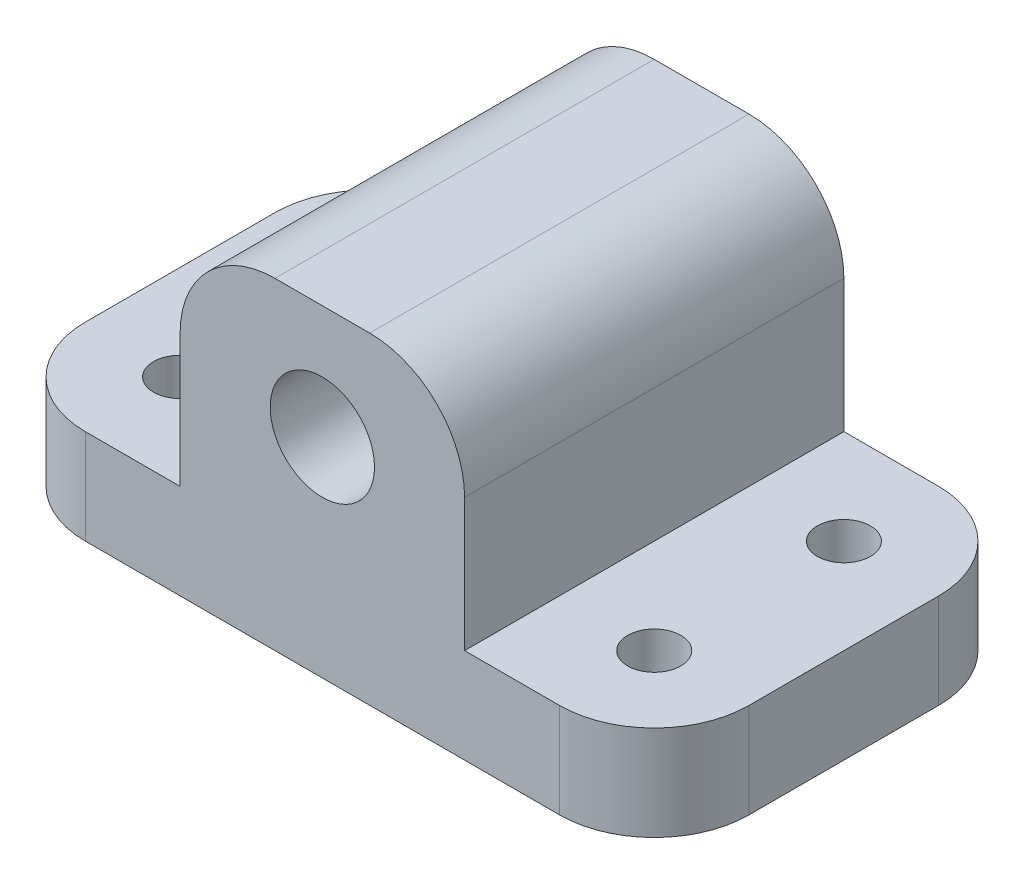
ISO-10303-21;
HEADER;
FILE_DESCRIPTION(('STEP AP214'),'2;1');
FILE_NAME('part.step','',(''),(''),'','','');
FILE_SCHEMA(('AUTOMOTIVE_DESIGN { 1 0 10303 214 1 1 1 1 }'));
ENDSEC;
DATA;
#1=APPLICATION_CONTEXT('core data for automotive mechanical design processes');
#2=APPLICATION_PROTOCOL_DEFINITION('international standard','automotive_design',2000,#1);
#3=PRODUCT_CONTEXT('',#1,'mechanical');
#4=PRODUCT('Part','Part','',(#3));
#5=PRODUCT_RELATED_PRODUCT_CATEGORY('part','',(#4));
#6=PRODUCT_DEFINITION_FORMATION('','',#4);
#7=PRODUCT_DEFINITION_CONTEXT('part definition',#1,'design');
#8=PRODUCT_DEFINITION('design','',#6,#7);
#9=PRODUCT_DEFINITION_SHAPE('','',#8);
#10=(LENGTH_UNIT() NAMED_UNIT(*) SI_UNIT(.MILLI.,.METRE.));
#11=(NAMED_UNIT(*) PLANE_ANGLE_UNIT() SI_UNIT($,.RADIAN.));
#12=(NAMED_UNIT(*) SI_UNIT($,.STERADIAN.) SOLID_ANGLE_UNIT());
#13=UNCERTAINTY_MEASURE_WITH_UNIT(LENGTH_MEASURE(1.E-05),#10,'distance_accuracy_value','');
#14=(GEOMETRIC_REPRESENTATION_CONTEXT(3) GLOBAL_UNCERTAINTY_ASSIGNED_CONTEXT((#13)) GLOBAL_UNIT_ASSIGNED_CONTEXT((#10,
#11,#12)) REPRESENTATION_CONTEXT('',''));
#15=CARTESIAN_POINT('',(0.,0.,0.));
#16=DIRECTION('',(0.,0.,1.));
#17=DIRECTION('',(1.,0.,0.));
#18=AXIS2_PLACEMENT_3D('',#15,#16,#17);
#19=CARTESIAN_POINT('',(0.,0.,25.4));
#20=DIRECTION('',(0.,0.,1.));
#21=DIRECTION('',(1.,0.,0.));
#22=AXIS2_PLACEMENT_3D('',#19,#20,#21);
#23=PLANE('',#22);
#24=DIRECTION('',(1.,0.,0.));
#25=VECTOR('',#24,1.);
#26=CARTESIAN_POINT('',(0.,0.,25.4));
#27=LINE('',#26,#25);
#28=CARTESIAN_POINT('',(6.35,0.,25.4));
#29=VERTEX_POINT('',#28);
#30=CARTESIAN_POINT('',(38.1,0.,25.4));
#31=VERTEX_POINT('',#30);
#32=EDGE_CURVE('E146',#29,#31,#27,.T.);
#33=ORIENTED_EDGE('',*,*,#32,.T.);
#34=DIRECTION('',(0.,1.,0.));
#35=VECTOR('',#34,1.);
#36=CARTESIAN_POINT('',(38.1,6.35,25.4));
#37=LINE('',#36,#35);
#38=CARTESIAN_POINT('',(38.1,6.35,25.4));
#39=VERTEX_POINT('',#38);
#40=EDGE_CURVE('E11',#31,#39,#37,.T.);
#41=ORIENTED_EDGE('',*,*,#40,.T.);
#42=DIRECTION('',(-1.,0.,0.));
#43=VECTOR('',#42,1.);
#44=CARTESIAN_POINT('',(44.45,6.35,25.4));
#45=LINE('',#44,#43);
#46=CARTESIAN_POINT('',(31.75,6.35,25.4));
#47=VERTEX_POINT('',#46);
#48=EDGE_CURVE('E138',#39,#47,#45,.T.);
#49=ORIENTED_EDGE('',*,*,#48,.T.);
#50=DIRECTION('',(0.,1.,0.));
#51=VECTOR('',#50,1.);
#52=CARTESIAN_POINT('',(31.75,6.35,25.4));
#53=LINE('',#52,#51);
#54=CARTESIAN_POINT('',(31.75,15.24,25.4));
#55=VERTEX_POINT('',#54);
#56=EDGE_CURVE('E143',#47,#55,#53,.T.);
#57=ORIENTED_EDGE('',*,*,#56,.T.);
#58=CARTESIAN_POINT('',(25.4,15.24,25.4));
#59=DIRECTION('',(0.,0.,1.));
#60=DIRECTION('',(1.,0.,0.));
#61=AXIS2_PLACEMENT_3D('',#58,#59,#60);
#62=CIRCLE('',#61,6.35);
#63=CARTESIAN_POINT('',(25.4,21.59,25.4));
#64=VERTEX_POINT('',#63);
#65=EDGE_CURVE('E213',#55,#64,#62,.T.);
#66=ORIENTED_EDGE('',*,*,#65,.T.);
#67=DIRECTION('',(-1.,0.,0.));
#68=VECTOR('',#67,1.);
#69=CARTESIAN_POINT('',(31.75,21.59,25.4));
#70=LINE('',#69,#68);
#71=CARTESIAN_POINT('',(19.05,21.59,25.4));
#72=VERTEX_POINT('',#71);
#73=EDGE_CURVE('E163',#64,#72,#70,.T.);
#74=ORIENTED_EDGE('',*,*,#73,.T.);
#75=CARTESIAN_POINT('',(19.05,15.24,25.4));
#76=DIRECTION('',(0.,0.,1.));
#77=DIRECTION('',(1.,0.,0.));
#78=AXIS2_PLACEMENT_3D('',#75,#76,#77);
#79=CIRCLE('',#78,6.35);
#80=CARTESIAN_POINT('',(12.7,15.24,25.4));
#81=VERTEX_POINT('',#80);
#82=EDGE_CURVE('E211',#72,#81,#79,.T.);
#83=ORIENTED_EDGE('',*,*,#82,.T.);
#84=DIRECTION('',(0.,-1.,0.));
#85=VECTOR('',#84,1.);
#86=CARTESIAN_POINT('',(12.7,21.59,25.4));
#87=LINE('',#86,#85);
#88=CARTESIAN_POINT('',(12.7,6.35,25.4));
#89=VERTEX_POINT('',#88);
#90=EDGE_CURVE('E166',#81,#89,#87,.T.);
#91=ORIENTED_EDGE('',*,*,#90,.T.);
#92=DIRECTION('',(-1.,0.,0.));
#93=VECTOR('',#92,1.);
#94=CARTESIAN_POINT('',(12.7,6.35,25.4));
#95=LINE('',#94,#93);
#96=CARTESIAN_POINT('',(6.35,6.35,25.4));
#97=VERTEX_POINT('',#96);
#98=EDGE_CURVE('E171',#89,#97,#95,.T.);
#99=ORIENTED_EDGE('',*,*,#98,.T.);
#100=DIRECTION('',(0.,-1.,0.));
#101=VECTOR('',#100,1.);
#102=CARTESIAN_POINT('',(6.35,0.,25.4));
#103=LINE('',#102,#101);
#104=EDGE_CURVE('E44',#97,#29,#103,.T.);
#105=ORIENTED_EDGE('',*,*,#104,.T.);
#106=EDGE_LOOP('',(#33,#41,#49,#57,#66,#74,#83,#91,#99,#105));
#107=FACE_BOUND('',#106,.T.);
#108=CARTESIAN_POINT('',(22.225,13.97,25.4));
#109=DIRECTION('',(0.,0.,1.));
#110=DIRECTION('',(1.,0.,0.));
#111=AXIS2_PLACEMENT_3D('',#108,#109,#110);
#112=CIRCLE('',#111,3.4925);
#113=CARTESIAN_POINT('',(25.7175,13.97,25.4));
#114=VERTEX_POINT('',#113);
#115=EDGE_CURVE('E178',#114,#114,#112,.T.);
#116=ORIENTED_EDGE('',*,*,#115,.F.);
#117=EDGE_LOOP('',(#116));
#118=FACE_BOUND('',#117,.T.);
#119=ADVANCED_FACE('F36',(#107,#118),#23,.T.);
#120=CARTESIAN_POINT('',(0.,0.,0.));
#121=DIRECTION('',(0.,0.,1.));
#122=DIRECTION('',(1.,0.,0.));
#123=AXIS2_PLACEMENT_3D('',#120,#121,#122);
#124=PLANE('',#123);
#125=DIRECTION('',(1.,0.,0.));
#126=VECTOR('',#125,1.);
#127=CARTESIAN_POINT('',(0.,0.,0.));
#128=LINE('',#127,#126);
#129=CARTESIAN_POINT('',(6.35,0.,0.));
#130=VERTEX_POINT('',#129);
#131=CARTESIAN_POINT('',(38.1,0.,0.));
#132=VERTEX_POINT('',#131);
#133=EDGE_CURVE('E175',#130,#132,#128,.T.);
#134=ORIENTED_EDGE('',*,*,#133,.F.);
#135=DIRECTION('',(0.,-1.,0.));
#136=VECTOR('',#135,1.);
#137=CARTESIAN_POINT('',(6.35,0.,0.));
#138=LINE('',#137,#136);
#139=CARTESIAN_POINT('',(6.35,6.35,0.));
#140=VERTEX_POINT('',#139);
#141=EDGE_CURVE('E233',#130,#140,#138,.F.);
#142=ORIENTED_EDGE('',*,*,#141,.T.);
#143=DIRECTION('',(-1.,0.,0.));
#144=VECTOR('',#143,1.);
#145=CARTESIAN_POINT('',(12.7,6.35,0.));
#146=LINE('',#145,#144);
#147=CARTESIAN_POINT('',(12.7,6.35,0.));
#148=VERTEX_POINT('',#147);
#149=EDGE_CURVE('E187',#148,#140,#146,.T.);
#150=ORIENTED_EDGE('',*,*,#149,.F.);
#151=DIRECTION('',(0.,-1.,0.));
#152=VECTOR('',#151,1.);
#153=CARTESIAN_POINT('',(12.7,21.59,0.));
#154=LINE('',#153,#152);
#155=CARTESIAN_POINT('',(12.7,15.24,0.));
#156=VERTEX_POINT('',#155);
#157=EDGE_CURVE('E185',#156,#148,#154,.T.);
#158=ORIENTED_EDGE('',*,*,#157,.F.);
#159=CARTESIAN_POINT('',(19.05,15.24,0.));
#160=DIRECTION('',(0.,0.,1.));
#161=DIRECTION('',(1.,0.,0.));
#162=AXIS2_PLACEMENT_3D('',#159,#160,#161);
#163=CIRCLE('',#162,6.35);
#164=CARTESIAN_POINT('',(19.05,21.59,0.));
#165=VERTEX_POINT('',#164);
#166=EDGE_CURVE('E206',#156,#165,#163,.F.);
#167=ORIENTED_EDGE('',*,*,#166,.T.);
#168=DIRECTION('',(-1.,0.,0.));
#169=VECTOR('',#168,1.);
#170=CARTESIAN_POINT('',(31.75,21.59,0.));
#171=LINE('',#170,#169);
#172=CARTESIAN_POINT('',(25.4,21.59,0.));
#173=VERTEX_POINT('',#172);
#174=EDGE_CURVE('E182',#173,#165,#171,.T.);
#175=ORIENTED_EDGE('',*,*,#174,.F.);
#176=CARTESIAN_POINT('',(25.4,15.24,0.));
#177=DIRECTION('',(0.,0.,1.));
#178=DIRECTION('',(1.,0.,0.));
#179=AXIS2_PLACEMENT_3D('',#176,#177,#178);
#180=CIRCLE('',#179,6.35);
#181=CARTESIAN_POINT('',(31.75,15.24,0.));
#182=VERTEX_POINT('',#181);
#183=EDGE_CURVE('E208',#173,#182,#180,.F.);
#184=ORIENTED_EDGE('',*,*,#183,.T.);
#185=DIRECTION('',(0.,1.,0.));
#186=VECTOR('',#185,1.);
#187=CARTESIAN_POINT('',(31.75,6.35,0.));
#188=LINE('',#187,#186);
#189=CARTESIAN_POINT('',(31.75,6.35,0.));
#190=VERTEX_POINT('',#189);
#191=EDGE_CURVE('E180',#190,#182,#188,.T.);
#192=ORIENTED_EDGE('',*,*,#191,.F.);
#193=DIRECTION('',(-1.,0.,0.));
#194=VECTOR('',#193,1.);
#195=CARTESIAN_POINT('',(44.45,6.35,0.));
#196=LINE('',#195,#194);
#197=CARTESIAN_POINT('',(38.1,6.35,0.));
#198=VERTEX_POINT('',#197);
#199=EDGE_CURVE('E153',#198,#190,#196,.T.);
#200=ORIENTED_EDGE('',*,*,#199,.F.);
#201=DIRECTION('',(0.,1.,0.));
#202=VECTOR('',#201,1.);
#203=CARTESIAN_POINT('',(38.1,0.,0.));
#204=LINE('',#203,#202);
#205=EDGE_CURVE('E231',#198,#132,#204,.F.);
#206=ORIENTED_EDGE('',*,*,#205,.T.);
#207=EDGE_LOOP('',(#134,#142,#150,#158,#167,#175,#184,#192,#200,#206));
#208=FACE_BOUND('',#207,.T.);
#209=CARTESIAN_POINT('',(22.225,13.97,0.));
#210=DIRECTION('',(0.,0.,1.));
#211=DIRECTION('',(1.,0.,0.));
#212=AXIS2_PLACEMENT_3D('',#209,#210,#211);
#213=CIRCLE('',#212,3.4925);
#214=CARTESIAN_POINT('',(25.7175,13.97,0.));
#215=VERTEX_POINT('',#214);
#216=EDGE_CURVE('E256',#215,#215,#213,.T.);
#217=ORIENTED_EDGE('',*,*,#216,.T.);
#218=EDGE_LOOP('',(#217));
#219=FACE_BOUND('',#218,.T.);
#220=ADVANCED_FACE('F310',(#208,#219),#124,.F.);
#221=CARTESIAN_POINT('',(0.,6.35,25.4));
#222=DIRECTION('',(1.,0.,0.));
#223=DIRECTION('',(0.,0.,-1.));
#224=AXIS2_PLACEMENT_3D('',#221,#222,#223);
#225=PLANE('',#224);
#226=DIRECTION('',(0.,0.,-1.));
#227=VECTOR('',#226,1.);
#228=CARTESIAN_POINT('',(0.,6.35,25.4));
#229=LINE('',#228,#227);
#230=CARTESIAN_POINT('',(0.,6.35,19.05));
#231=VERTEX_POINT('',#230);
#232=CARTESIAN_POINT('',(0.,6.35,6.35));
#233=VERTEX_POINT('',#232);
#234=EDGE_CURVE('E174',#231,#233,#229,.T.);
#235=ORIENTED_EDGE('',*,*,#234,.T.);
#236=DIRECTION('',(0.,-1.,0.));
#237=VECTOR('',#236,1.);
#238=CARTESIAN_POINT('',(0.,6.35,6.35));
#239=LINE('',#238,#237);
#240=CARTESIAN_POINT('',(0.,0.,6.35));
#241=VERTEX_POINT('',#240);
#242=EDGE_CURVE('E220',#233,#241,#239,.T.);
#243=ORIENTED_EDGE('',*,*,#242,.T.);
#244=DIRECTION('',(0.,0.,-1.));
#245=VECTOR('',#244,1.);
#246=CARTESIAN_POINT('',(0.,0.,25.4));
#247=LINE('',#246,#245);
#248=CARTESIAN_POINT('',(0.,0.,19.05));
#249=VERTEX_POINT('',#248);
#250=EDGE_CURVE('E198',#249,#241,#247,.T.);
#251=ORIENTED_EDGE('',*,*,#250,.F.);
#252=DIRECTION('',(0.,-1.,0.));
#253=VECTOR('',#252,1.);
#254=CARTESIAN_POINT('',(0.,6.35,19.05));
#255=LINE('',#254,#253);
#256=EDGE_CURVE('E218',#249,#231,#255,.F.);
#257=ORIENTED_EDGE('',*,*,#256,.T.);
#258=EDGE_LOOP('',(#235,#243,#251,#257));
#259=FACE_BOUND('',#258,.T.);
#260=ADVANCED_FACE('F315',(#259),#225,.F.);
#261=CARTESIAN_POINT('',(0.,0.,25.4));
#262=DIRECTION('',(0.,1.,0.));
#263=DIRECTION('',(0.,0.,1.));
#264=AXIS2_PLACEMENT_3D('',#261,#262,#263);
#265=PLANE('',#264);
#266=CARTESIAN_POINT('',(6.35,0.,19.05));
#267=DIRECTION('',(0.,1.,0.));
#268=DIRECTION('',(0.,0.,1.));
#269=AXIS2_PLACEMENT_3D('',#266,#267,#268);
#270=CIRCLE('',#269,1.778);
#271=CARTESIAN_POINT('',(6.35,0.,20.828));
#272=VERTEX_POINT('',#271);
#273=EDGE_CURVE('E265',#272,#272,#270,.T.);
#274=ORIENTED_EDGE('',*,*,#273,.T.);
#275=EDGE_LOOP('',(#274));
#276=FACE_BOUND('',#275,.T.);
#277=CARTESIAN_POINT('',(38.1,0.,6.34999999999999));
#278=DIRECTION('',(0.,1.,0.));
#279=DIRECTION('',(0.,0.,1.));
#280=AXIS2_PLACEMENT_3D('',#277,#278,#279);
#281=CIRCLE('',#280,1.778);
#282=CARTESIAN_POINT('',(38.1,0.,8.12799999999999));
#283=VERTEX_POINT('',#282);
#284=EDGE_CURVE('E271',#283,#283,#281,.T.);
#285=ORIENTED_EDGE('',*,*,#284,.T.);
#286=EDGE_LOOP('',(#285));
#287=FACE_BOUND('',#286,.T.);
#288=CARTESIAN_POINT('',(38.1,0.,19.05));
#289=DIRECTION('',(0.,1.,0.));
#290=DIRECTION('',(0.,0.,1.));
#291=AXIS2_PLACEMENT_3D('',#288,#289,#290);
#292=CIRCLE('',#291,1.778);
#293=CARTESIAN_POINT('',(38.1,0.,20.828));
#294=VERTEX_POINT('',#293);
#295=EDGE_CURVE('E272',#294,#294,#292,.T.);
#296=ORIENTED_EDGE('',*,*,#295,.T.);
#297=EDGE_LOOP('',(#296));
#298=FACE_BOUND('',#297,.T.);
#299=CARTESIAN_POINT('',(6.35,0.,6.34999999999999));
#300=DIRECTION('',(0.,1.,0.));
#301=DIRECTION('',(0.,0.,1.));
#302=AXIS2_PLACEMENT_3D('',#299,#300,#301);
#303=CIRCLE('',#302,1.778);
#304=CARTESIAN_POINT('',(6.35,0.,8.12799999999999));
#305=VERTEX_POINT('',#304);
#306=EDGE_CURVE('E259',#305,#305,#303,.T.);
#307=ORIENTED_EDGE('',*,*,#306,.T.);
#308=EDGE_LOOP('',(#307));
#309=FACE_BOUND('',#308,.T.);
#310=ORIENTED_EDGE('',*,*,#250,.T.);
#311=CARTESIAN_POINT('',(6.35,0.,6.35));
#312=DIRECTION('',(0.,1.,0.));
#313=DIRECTION('',(0.,0.,1.));
#314=AXIS2_PLACEMENT_3D('',#311,#312,#313);
#315=CIRCLE('',#314,6.35);
#316=EDGE_CURVE('E229',#241,#130,#315,.F.);
#317=ORIENTED_EDGE('',*,*,#316,.T.);
#318=ORIENTED_EDGE('',*,*,#133,.T.);
#319=CARTESIAN_POINT('',(38.1,0.,6.35));
#320=DIRECTION('',(0.,1.,0.));
#321=DIRECTION('',(0.,0.,1.));
#322=AXIS2_PLACEMENT_3D('',#319,#320,#321);
#323=CIRCLE('',#322,6.35);
#324=CARTESIAN_POINT('',(44.45,0.,6.35));
#325=VERTEX_POINT('',#324);
#326=EDGE_CURVE('E227',#132,#325,#323,.F.);
#327=ORIENTED_EDGE('',*,*,#326,.T.);
#328=DIRECTION('',(0.,0.,-1.));
#329=VECTOR('',#328,1.);
#330=CARTESIAN_POINT('',(44.45,0.,25.4));
#331=LINE('',#330,#329);
#332=CARTESIAN_POINT('',(44.45,0.,19.05));
#333=VERTEX_POINT('',#332);
#334=EDGE_CURVE('E195',#333,#325,#331,.T.);
#335=ORIENTED_EDGE('',*,*,#334,.F.);
#336=CARTESIAN_POINT('',(38.1,0.,19.05));
#337=DIRECTION('',(0.,1.,0.));
#338=DIRECTION('',(0.,0.,1.));
#339=AXIS2_PLACEMENT_3D('',#336,#337,#338);
#340=CIRCLE('',#339,6.35);
#341=EDGE_CURVE('E225',#333,#31,#340,.F.);
#342=ORIENTED_EDGE('',*,*,#341,.T.);
#343=ORIENTED_EDGE('',*,*,#32,.F.);
#344=CARTESIAN_POINT('',(6.35,0.,19.05));
#345=DIRECTION('',(0.,1.,0.));
#346=DIRECTION('',(0.,0.,1.));
#347=AXIS2_PLACEMENT_3D('',#344,#345,#346);
#348=CIRCLE('',#347,6.35);
#349=EDGE_CURVE('E223',#29,#249,#348,.F.);
#350=ORIENTED_EDGE('',*,*,#349,.T.);
#351=EDGE_LOOP('',(#310,#317,#318,#327,#335,#342,#343,#350));
#352=FACE_BOUND('',#351,.T.);
#353=ADVANCED_FACE('F251',(#276,#287,#298,#309,#352),#265,.F.);
#354=CARTESIAN_POINT('',(44.45,0.,25.4));
#355=DIRECTION('',(-1.,0.,0.));
#356=DIRECTION('',(0.,0.,1.));
#357=AXIS2_PLACEMENT_3D('',#354,#355,#356);
#358=PLANE('',#357);
#359=ORIENTED_EDGE('',*,*,#334,.T.);
#360=DIRECTION('',(0.,1.,0.));
#361=VECTOR('',#360,1.);
#362=CARTESIAN_POINT('',(44.45,0.,6.35));
#363=LINE('',#362,#361);
#364=CARTESIAN_POINT('',(44.45,6.35,6.35));
#365=VERTEX_POINT('',#364);
#366=EDGE_CURVE('E241',#325,#365,#363,.T.);
#367=ORIENTED_EDGE('',*,*,#366,.T.);
#368=DIRECTION('',(0.,0.,-1.));
#369=VECTOR('',#368,1.);
#370=CARTESIAN_POINT('',(44.45,6.35,25.4));
#371=LINE('',#370,#369);
#372=CARTESIAN_POINT('',(44.45,6.35,19.05));
#373=VERTEX_POINT('',#372);
#374=EDGE_CURVE('E157',#373,#365,#371,.T.);
#375=ORIENTED_EDGE('',*,*,#374,.F.);
#376=DIRECTION('',(0.,1.,0.));
#377=VECTOR('',#376,1.);
#378=CARTESIAN_POINT('',(44.45,0.,19.05));
#379=LINE('',#378,#377);
#380=EDGE_CURVE('E239',#373,#333,#379,.F.);
#381=ORIENTED_EDGE('',*,*,#380,.T.);
#382=EDGE_LOOP('',(#359,#367,#375,#381));
#383=FACE_BOUND('',#382,.T.);
#384=ADVANCED_FACE('F297',(#383),#358,.F.);
#385=CARTESIAN_POINT('',(44.45,6.35,25.4));
#386=DIRECTION('',(0.,-1.,0.));
#387=DIRECTION('',(0.,0.,-1.));
#388=AXIS2_PLACEMENT_3D('',#385,#386,#387);
#389=PLANE('',#388);
#390=CARTESIAN_POINT('',(38.1,6.35,6.34999999999999));
#391=DIRECTION('',(0.,1.,0.));
#392=DIRECTION('',(0.,0.,1.));
#393=AXIS2_PLACEMENT_3D('',#390,#391,#392);
#394=CIRCLE('',#393,1.778);
#395=CARTESIAN_POINT('',(38.1,6.35,8.12799999999999));
#396=VERTEX_POINT('',#395);
#397=EDGE_CURVE('E268',#396,#396,#394,.T.);
#398=ORIENTED_EDGE('',*,*,#397,.F.);
#399=EDGE_LOOP('',(#398));
#400=FACE_BOUND('',#399,.T.);
#401=CARTESIAN_POINT('',(38.1,6.35,19.05));
#402=DIRECTION('',(0.,1.,0.));
#403=DIRECTION('',(0.,0.,1.));
#404=AXIS2_PLACEMENT_3D('',#401,#402,#403);
#405=CIRCLE('',#404,1.778);
#406=CARTESIAN_POINT('',(38.1,6.35,20.828));
#407=VERTEX_POINT('',#406);
#408=EDGE_CURVE('E280',#407,#407,#405,.T.);
#409=ORIENTED_EDGE('',*,*,#408,.F.);
#410=EDGE_LOOP('',(#409));
#411=FACE_BOUND('',#410,.T.);
#412=ORIENTED_EDGE('',*,*,#374,.T.);
#413=CARTESIAN_POINT('',(38.1,6.35,6.35));
#414=DIRECTION('',(0.,-1.,0.));
#415=DIRECTION('',(0.,0.,-1.));
#416=AXIS2_PLACEMENT_3D('',#413,#414,#415);
#417=CIRCLE('',#416,6.35);
#418=EDGE_CURVE('E58',#365,#198,#417,.F.);
#419=ORIENTED_EDGE('',*,*,#418,.T.);
#420=ORIENTED_EDGE('',*,*,#199,.T.);
#421=DIRECTION('',(0.,0.,-1.));
#422=VECTOR('',#421,1.);
#423=CARTESIAN_POINT('',(31.75,6.35,25.4));
#424=LINE('',#423,#422);
#425=EDGE_CURVE('E149',#47,#190,#424,.T.);
#426=ORIENTED_EDGE('',*,*,#425,.F.);
#427=ORIENTED_EDGE('',*,*,#48,.F.);
#428=CARTESIAN_POINT('',(38.1,6.35,19.05));
#429=DIRECTION('',(0.,-1.,0.));
#430=DIRECTION('',(0.,0.,-1.));
#431=AXIS2_PLACEMENT_3D('',#428,#429,#430);
#432=CIRCLE('',#431,6.35);
#433=EDGE_CURVE('E51',#39,#373,#432,.F.);
#434=ORIENTED_EDGE('',*,*,#433,.T.);
#435=EDGE_LOOP('',(#412,#419,#420,#426,#427,#434));
#436=FACE_BOUND('',#435,.T.);
#437=ADVANCED_FACE('F151',(#400,#411,#436),#389,.F.);
#438=CARTESIAN_POINT('',(31.75,6.35,25.4));
#439=DIRECTION('',(-1.,0.,0.));
#440=DIRECTION('',(0.,-1.,0.));
#441=AXIS2_PLACEMENT_3D('',#438,#439,#440);
#442=PLANE('',#441);
#443=ORIENTED_EDGE('',*,*,#191,.T.);
#444=DIRECTION('',(0.,0.,-1.));
#445=VECTOR('',#444,1.);
#446=CARTESIAN_POINT('',(31.75,15.24,25.4));
#447=LINE('',#446,#445);
#448=EDGE_CURVE('E162',#182,#55,#447,.F.);
#449=ORIENTED_EDGE('',*,*,#448,.T.);
#450=ORIENTED_EDGE('',*,*,#56,.F.);
#451=ORIENTED_EDGE('',*,*,#425,.T.);
#452=EDGE_LOOP('',(#443,#449,#450,#451));
#453=FACE_BOUND('',#452,.T.);
#454=ADVANCED_FACE('F160',(#453),#442,.F.);
#455=CARTESIAN_POINT('',(31.75,21.59,25.4));
#456=DIRECTION('',(0.,-1.,0.));
#457=DIRECTION('',(1.,0.,0.));
#458=AXIS2_PLACEMENT_3D('',#455,#456,#457);
#459=PLANE('',#458);
#460=ORIENTED_EDGE('',*,*,#73,.F.);
#461=DIRECTION('',(0.,0.,-1.));
#462=VECTOR('',#461,1.);
#463=CARTESIAN_POINT('',(25.4,21.59,25.4));
#464=LINE('',#463,#462);
#465=EDGE_CURVE('E203',#64,#173,#464,.T.);
#466=ORIENTED_EDGE('',*,*,#465,.T.);
#467=ORIENTED_EDGE('',*,*,#174,.T.);
#468=DIRECTION('',(0.,0.,-1.));
#469=VECTOR('',#468,1.);
#470=CARTESIAN_POINT('',(19.05,21.59,25.4));
#471=LINE('',#470,#469);
#472=EDGE_CURVE('E201',#165,#72,#471,.F.);
#473=ORIENTED_EDGE('',*,*,#472,.T.);
#474=EDGE_LOOP('',(#460,#466,#467,#473));
#475=FACE_BOUND('',#474,.T.);
#476=ADVANCED_FACE('F304',(#475),#459,.F.);
#477=CARTESIAN_POINT('',(12.7,21.59,25.4));
#478=DIRECTION('',(1.,0.,0.));
#479=DIRECTION('',(0.,0.,-1.));
#480=AXIS2_PLACEMENT_3D('',#477,#478,#479);
#481=PLANE('',#480);
#482=ORIENTED_EDGE('',*,*,#90,.F.);
#483=DIRECTION('',(0.,0.,-1.));
#484=VECTOR('',#483,1.);
#485=CARTESIAN_POINT('',(12.7,15.24,25.4));
#486=LINE('',#485,#484);
#487=EDGE_CURVE('E215',#81,#156,#486,.T.);
#488=ORIENTED_EDGE('',*,*,#487,.T.);
#489=ORIENTED_EDGE('',*,*,#157,.T.);
#490=DIRECTION('',(0.,0.,-1.));
#491=VECTOR('',#490,1.);
#492=CARTESIAN_POINT('',(12.7,6.35,25.4));
#493=LINE('',#492,#491);
#494=EDGE_CURVE('E158',#89,#148,#493,.T.);
#495=ORIENTED_EDGE('',*,*,#494,.F.);
#496=EDGE_LOOP('',(#482,#488,#489,#495));
#497=FACE_BOUND('',#496,.T.);
#498=ADVANCED_FACE('F325',(#497),#481,.F.);
#499=CARTESIAN_POINT('',(12.7,6.35,25.4));
#500=DIRECTION('',(0.,-1.,0.));
#501=DIRECTION('',(0.,0.,-1.));
#502=AXIS2_PLACEMENT_3D('',#499,#500,#501);
#503=PLANE('',#502);
#504=CARTESIAN_POINT('',(6.35,6.35,19.05));
#505=DIRECTION('',(0.,1.,0.));
#506=DIRECTION('',(0.,0.,1.));
#507=AXIS2_PLACEMENT_3D('',#504,#505,#506);
#508=CIRCLE('',#507,1.778);
#509=CARTESIAN_POINT('',(6.35,6.35,20.828));
#510=VERTEX_POINT('',#509);
#511=EDGE_CURVE('E275',#510,#510,#508,.T.);
#512=ORIENTED_EDGE('',*,*,#511,.F.);
#513=EDGE_LOOP('',(#512));
#514=FACE_BOUND('',#513,.T.);
#515=CARTESIAN_POINT('',(6.35,6.35,6.34999999999999));
#516=DIRECTION('',(0.,1.,0.));
#517=DIRECTION('',(0.,0.,1.));
#518=AXIS2_PLACEMENT_3D('',#515,#516,#517);
#519=CIRCLE('',#518,1.778);
#520=CARTESIAN_POINT('',(6.35,6.35,8.12799999999999));
#521=VERTEX_POINT('',#520);
#522=EDGE_CURVE('E262',#521,#521,#519,.T.);
#523=ORIENTED_EDGE('',*,*,#522,.F.);
#524=EDGE_LOOP('',(#523));
#525=FACE_BOUND('',#524,.T.);
#526=ORIENTED_EDGE('',*,*,#149,.T.);
#527=CARTESIAN_POINT('',(6.35,6.35,6.35));
#528=DIRECTION('',(0.,-1.,0.));
#529=DIRECTION('',(0.,0.,-1.));
#530=AXIS2_PLACEMENT_3D('',#527,#528,#529);
#531=CIRCLE('',#530,6.35);
#532=EDGE_CURVE('E237',#140,#233,#531,.F.);
#533=ORIENTED_EDGE('',*,*,#532,.T.);
#534=ORIENTED_EDGE('',*,*,#234,.F.);
#535=CARTESIAN_POINT('',(6.35,6.35,19.05));
#536=DIRECTION('',(0.,-1.,0.));
#537=DIRECTION('',(0.,0.,-1.));
#538=AXIS2_PLACEMENT_3D('',#535,#536,#537);
#539=CIRCLE('',#538,6.35);
#540=EDGE_CURVE('E235',#231,#97,#539,.F.);
#541=ORIENTED_EDGE('',*,*,#540,.T.);
#542=ORIENTED_EDGE('',*,*,#98,.F.);
#543=ORIENTED_EDGE('',*,*,#494,.T.);
#544=EDGE_LOOP('',(#526,#533,#534,#541,#542,#543));
#545=FACE_BOUND('',#544,.T.);
#546=ADVANCED_FACE('F322',(#514,#525,#545),#503,.F.);
#547=CARTESIAN_POINT('',(22.225,13.97,25.4));
#548=DIRECTION('',(0.,0.,-1.));
#549=DIRECTION('',(-1.,0.,0.));
#550=AXIS2_PLACEMENT_3D('',#547,#548,#549);
#551=CYLINDRICAL_SURFACE('',#550,3.4925);
#552=ORIENTED_EDGE('',*,*,#115,.T.);
#553=EDGE_LOOP('',(#552));
#554=FACE_BOUND('',#553,.T.);
#555=ORIENTED_EDGE('',*,*,#216,.F.);
#556=EDGE_LOOP('',(#555));
#557=FACE_BOUND('',#556,.T.);
#558=ADVANCED_FACE('F319',(#554,#557),#551,.F.);
#559=CARTESIAN_POINT('',(6.35,0.,6.34999999999999));
#560=DIRECTION('',(0.,1.,0.));
#561=DIRECTION('',(0.,0.,1.));
#562=AXIS2_PLACEMENT_3D('',#559,#560,#561);
#563=CYLINDRICAL_SURFACE('',#562,1.778);
#564=ORIENTED_EDGE('',*,*,#306,.F.);
#565=EDGE_LOOP('',(#564));
#566=FACE_BOUND('',#565,.T.);
#567=ORIENTED_EDGE('',*,*,#522,.T.);
#568=EDGE_LOOP('',(#567));
#569=FACE_BOUND('',#568,.T.);
#570=ADVANCED_FACE('F490',(#566,#569),#563,.F.);
#571=CARTESIAN_POINT('',(6.35,0.,19.05));
#572=DIRECTION('',(0.,1.,0.));
#573=DIRECTION('',(0.,0.,1.));
#574=AXIS2_PLACEMENT_3D('',#571,#572,#573);
#575=CYLINDRICAL_SURFACE('',#574,1.778);
#576=ORIENTED_EDGE('',*,*,#273,.F.);
#577=EDGE_LOOP('',(#576));
#578=FACE_BOUND('',#577,.T.);
#579=ORIENTED_EDGE('',*,*,#511,.T.);
#580=EDGE_LOOP('',(#579));
#581=FACE_BOUND('',#580,.T.);
#582=ADVANCED_FACE('F292',(#578,#581),#575,.F.);
#583=CARTESIAN_POINT('',(38.1,0.,19.05));
#584=DIRECTION('',(0.,1.,0.));
#585=DIRECTION('',(0.,0.,1.));
#586=AXIS2_PLACEMENT_3D('',#583,#584,#585);
#587=CYLINDRICAL_SURFACE('',#586,1.778);
#588=ORIENTED_EDGE('',*,*,#295,.F.);
#589=EDGE_LOOP('',(#588));
#590=FACE_BOUND('',#589,.T.);
#591=ORIENTED_EDGE('',*,*,#408,.T.);
#592=EDGE_LOOP('',(#591));
#593=FACE_BOUND('',#592,.T.);
#594=ADVANCED_FACE('F288',(#590,#593),#587,.F.);
#595=CARTESIAN_POINT('',(38.1,0.,6.34999999999999));
#596=DIRECTION('',(0.,1.,0.));
#597=DIRECTION('',(0.,0.,1.));
#598=AXIS2_PLACEMENT_3D('',#595,#596,#597);
#599=CYLINDRICAL_SURFACE('',#598,1.778);
#600=ORIENTED_EDGE('',*,*,#284,.F.);
#601=EDGE_LOOP('',(#600));
#602=FACE_BOUND('',#601,.T.);
#603=ORIENTED_EDGE('',*,*,#397,.T.);
#604=EDGE_LOOP('',(#603));
#605=FACE_BOUND('',#604,.T.);
#606=ADVANCED_FACE('F291',(#602,#605),#599,.F.);
#607=CARTESIAN_POINT('',(25.4,15.24,25.4));
#608=DIRECTION('',(0.,0.,-1.));
#609=DIRECTION('',(-1.,0.,0.));
#610=AXIS2_PLACEMENT_3D('',#607,#608,#609);
#611=CYLINDRICAL_SURFACE('',#610,6.35);
#612=ORIENTED_EDGE('',*,*,#65,.F.);
#613=ORIENTED_EDGE('',*,*,#448,.F.);
#614=ORIENTED_EDGE('',*,*,#183,.F.);
#615=ORIENTED_EDGE('',*,*,#465,.F.);
#616=EDGE_LOOP('',(#612,#613,#614,#615));
#617=FACE_BOUND('',#616,.T.);
#618=ADVANCED_FACE('F340',(#617),#611,.T.);
#619=CARTESIAN_POINT('',(19.05,15.24,25.4));
#620=DIRECTION('',(0.,0.,-1.));
#621=DIRECTION('',(-1.,0.,0.));
#622=AXIS2_PLACEMENT_3D('',#619,#620,#621);
#623=CYLINDRICAL_SURFACE('',#622,6.35);
#624=ORIENTED_EDGE('',*,*,#82,.F.);
#625=ORIENTED_EDGE('',*,*,#472,.F.);
#626=ORIENTED_EDGE('',*,*,#166,.F.);
#627=ORIENTED_EDGE('',*,*,#487,.F.);
#628=EDGE_LOOP('',(#624,#625,#626,#627));
#629=FACE_BOUND('',#628,.T.);
#630=ADVANCED_FACE('F345',(#629),#623,.T.);
#631=CARTESIAN_POINT('',(6.35,6.35,6.35));
#632=DIRECTION('',(0.,-1.,0.));
#633=DIRECTION('',(0.,0.,-1.));
#634=AXIS2_PLACEMENT_3D('',#631,#632,#633);
#635=CYLINDRICAL_SURFACE('',#634,6.35);
#636=ORIENTED_EDGE('',*,*,#532,.F.);
#637=ORIENTED_EDGE('',*,*,#141,.F.);
#638=ORIENTED_EDGE('',*,*,#316,.F.);
#639=ORIENTED_EDGE('',*,*,#242,.F.);
#640=EDGE_LOOP('',(#636,#637,#638,#639));
#641=FACE_BOUND('',#640,.T.);
#642=ADVANCED_FACE('F359',(#641),#635,.T.);
#643=CARTESIAN_POINT('',(38.1,0.,6.35));
#644=DIRECTION('',(0.,1.,0.));
#645=DIRECTION('',(0.,0.,1.));
#646=AXIS2_PLACEMENT_3D('',#643,#644,#645);
#647=CYLINDRICAL_SURFACE('',#646,6.35);
#648=ORIENTED_EDGE('',*,*,#326,.F.);
#649=ORIENTED_EDGE('',*,*,#205,.F.);
#650=ORIENTED_EDGE('',*,*,#418,.F.);
#651=ORIENTED_EDGE('',*,*,#366,.F.);
#652=EDGE_LOOP('',(#648,#649,#650,#651));
#653=FACE_BOUND('',#652,.T.);
#654=ADVANCED_FACE('F361',(#653),#647,.T.);
#655=CARTESIAN_POINT('',(38.1,0.,19.05));
#656=DIRECTION('',(0.,-1.,0.));
#657=DIRECTION('',(0.,0.,-1.));
#658=AXIS2_PLACEMENT_3D('',#655,#656,#657);
#659=CYLINDRICAL_SURFACE('',#658,6.35);
#660=ORIENTED_EDGE('',*,*,#341,.F.);
#661=ORIENTED_EDGE('',*,*,#380,.F.);
#662=ORIENTED_EDGE('',*,*,#433,.F.);
#663=ORIENTED_EDGE('',*,*,#40,.F.);
#664=EDGE_LOOP('',(#660,#661,#662,#663));
#665=FACE_BOUND('',#664,.T.);
#666=ADVANCED_FACE('F367',(#665),#659,.T.);
#667=CARTESIAN_POINT('',(6.35,0.,19.05));
#668=DIRECTION('',(0.,1.,0.));
#669=DIRECTION('',(0.,0.,1.));
#670=AXIS2_PLACEMENT_3D('',#667,#668,#669);
#671=CYLINDRICAL_SURFACE('',#670,6.35);
#672=ORIENTED_EDGE('',*,*,#540,.F.);
#673=ORIENTED_EDGE('',*,*,#256,.F.);
#674=ORIENTED_EDGE('',*,*,#349,.F.);
#675=ORIENTED_EDGE('',*,*,#104,.F.);
#676=EDGE_LOOP('',(#672,#673,#674,#675));
#677=FACE_BOUND('',#676,.T.);
#678=ADVANCED_FACE('F38',(#677),#671,.T.);
#679=CLOSED_SHELL('',(#119,#220,#260,#353,#384,#437,#454,#476,#498,#546,#558,#570,#582,#594,
#606,#618,#630,#642,#654,#666,#678));
#680=MANIFOLD_SOLID_BREP('B2',#679);
#681=ADVANCED_BREP_SHAPE_REPRESENTATION('',(#18,#680),#14);
#682=SHAPE_DEFINITION_REPRESENTATION(#9,#681);
ENDSEC;
END-ISO-10303-21;
